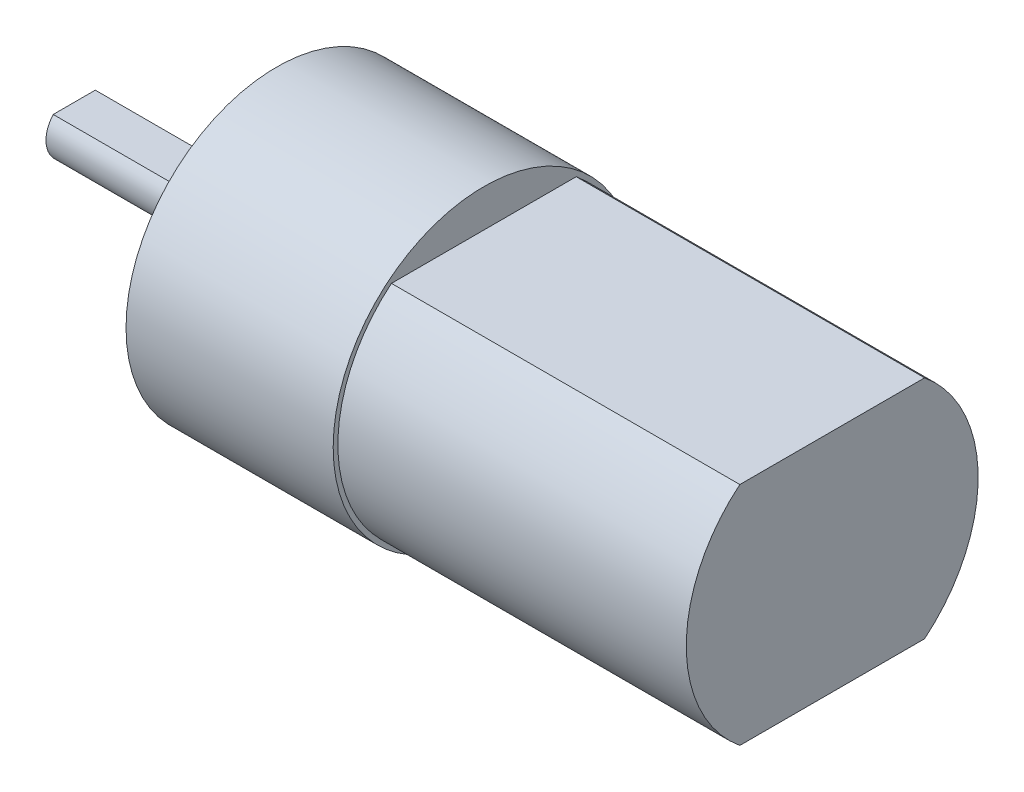
ISO-10303-21;
HEADER;
FILE_DESCRIPTION(('STEP AP214'),'2;1');
FILE_NAME('part.step','',(''),(''),'','','');
FILE_SCHEMA(('AUTOMOTIVE_DESIGN { 1 0 10303 214 1 1 1 1 }'));
ENDSEC;
DATA;
#1=APPLICATION_CONTEXT('core data for automotive mechanical design processes');
#2=APPLICATION_PROTOCOL_DEFINITION('international standard','automotive_design',2000,#1);
#3=PRODUCT_CONTEXT('',#1,'mechanical');
#4=PRODUCT('Part','Part','',(#3));
#5=PRODUCT_RELATED_PRODUCT_CATEGORY('part','',(#4));
#6=PRODUCT_DEFINITION_FORMATION('','',#4);
#7=PRODUCT_DEFINITION_CONTEXT('part definition',#1,'design');
#8=PRODUCT_DEFINITION('design','',#6,#7);
#9=PRODUCT_DEFINITION_SHAPE('','',#8);
#10=(LENGTH_UNIT() NAMED_UNIT(*) SI_UNIT(.MILLI.,.METRE.));
#11=(NAMED_UNIT(*) PLANE_ANGLE_UNIT() SI_UNIT($,.RADIAN.));
#12=(NAMED_UNIT(*) SI_UNIT($,.STERADIAN.) SOLID_ANGLE_UNIT());
#13=UNCERTAINTY_MEASURE_WITH_UNIT(LENGTH_MEASURE(1.E-05),#10,'distance_accuracy_value','');
#14=(GEOMETRIC_REPRESENTATION_CONTEXT(3) GLOBAL_UNCERTAINTY_ASSIGNED_CONTEXT((#13)) GLOBAL_UNIT_ASSIGNED_CONTEXT((#10,
#11,#12)) REPRESENTATION_CONTEXT('',''));
#15=CARTESIAN_POINT('',(0.,0.,0.));
#16=DIRECTION('',(0.,0.,1.));
#17=DIRECTION('',(1.,0.,0.));
#18=AXIS2_PLACEMENT_3D('',#15,#16,#17);
#19=CARTESIAN_POINT('',(-11.75,0.,0.));
#20=DIRECTION('',(-1.,0.,0.));
#21=DIRECTION('',(0.,0.,1.));
#22=AXIS2_PLACEMENT_3D('',#19,#20,#21);
#23=PLANE('',#22);
#24=CARTESIAN_POINT('',(-11.75,0.,0.));
#25=DIRECTION('',(-1.,0.,0.));
#26=DIRECTION('',(0.,0.,1.));
#27=AXIS2_PLACEMENT_3D('',#24,#25,#26);
#28=CIRCLE('',#27,2.);
#29=CARTESIAN_POINT('',(-11.75,0.,2.));
#30=VERTEX_POINT('',#29);
#31=EDGE_CURVE('E148',#30,#30,#28,.T.);
#32=ORIENTED_EDGE('',*,*,#31,.T.);
#33=EDGE_LOOP('',(#32));
#34=FACE_BOUND('',#33,.T.);
#35=CARTESIAN_POINT('',(-11.75,0.,0.));
#36=DIRECTION('',(-1.,0.,0.));
#37=DIRECTION('',(0.,0.,1.));
#38=AXIS2_PLACEMENT_3D('',#35,#36,#37);
#39=CIRCLE('',#38,1.5);
#40=CARTESIAN_POINT('',(-11.75,1.,-1.1180339887499));
#41=VERTEX_POINT('',#40);
#42=CARTESIAN_POINT('',(-11.75,1.,1.1180339887499));
#43=VERTEX_POINT('',#42);
#44=EDGE_CURVE('E141',#41,#43,#39,.T.);
#45=ORIENTED_EDGE('',*,*,#44,.F.);
#46=DIRECTION('',(0.,0.,-1.));
#47=VECTOR('',#46,1.);
#48=CARTESIAN_POINT('',(-11.75,1.,0.));
#49=LINE('',#48,#47);
#50=EDGE_CURVE('E142',#43,#41,#49,.T.);
#51=ORIENTED_EDGE('',*,*,#50,.F.);
#52=EDGE_LOOP('',(#45,#51));
#53=FACE_BOUND('',#52,.T.);
#54=ADVANCED_FACE('F35',(#34,#53),#23,.T.);
#55=CARTESIAN_POINT('',(-11.,0.,0.));
#56=DIRECTION('',(-1.,0.,0.));
#57=DIRECTION('',(0.,0.,1.));
#58=AXIS2_PLACEMENT_3D('',#55,#56,#57);
#59=PLANE('',#58);
#60=CARTESIAN_POINT('',(-11.,0.,4.5));
#61=DIRECTION('',(-1.,0.,0.));
#62=DIRECTION('',(0.,0.,1.));
#63=AXIS2_PLACEMENT_3D('',#60,#61,#62);
#64=CIRCLE('',#63,1.);
#65=CARTESIAN_POINT('',(-11.,0.,5.5));
#66=VERTEX_POINT('',#65);
#67=EDGE_CURVE('E340',#66,#66,#64,.T.);
#68=ORIENTED_EDGE('',*,*,#67,.F.);
#69=EDGE_LOOP('',(#68));
#70=FACE_BOUND('',#69,.T.);
#71=CARTESIAN_POINT('',(-11.,0.,-4.5));
#72=DIRECTION('',(-1.,0.,0.));
#73=DIRECTION('',(0.,0.,1.));
#74=AXIS2_PLACEMENT_3D('',#71,#72,#73);
#75=CIRCLE('',#74,1.);
#76=CARTESIAN_POINT('',(-11.,0.,-3.5));
#77=VERTEX_POINT('',#76);
#78=EDGE_CURVE('E339',#77,#77,#75,.T.);
#79=ORIENTED_EDGE('',*,*,#78,.F.);
#80=EDGE_LOOP('',(#79));
#81=FACE_BOUND('',#80,.T.);
#82=CARTESIAN_POINT('',(-11.,0.,0.));
#83=DIRECTION('',(-1.,0.,0.));
#84=DIRECTION('',(0.,0.,1.));
#85=AXIS2_PLACEMENT_3D('',#82,#83,#84);
#86=CIRCLE('',#85,8.);
#87=CARTESIAN_POINT('',(-11.,0.,8.));
#88=VERTEX_POINT('',#87);
#89=EDGE_CURVE('E109',#88,#88,#86,.T.);
#90=ORIENTED_EDGE('',*,*,#89,.T.);
#91=EDGE_LOOP('',(#90));
#92=FACE_BOUND('',#91,.T.);
#93=CARTESIAN_POINT('',(-11.,0.,0.));
#94=DIRECTION('',(-1.,0.,0.));
#95=DIRECTION('',(0.,0.,1.));
#96=AXIS2_PLACEMENT_3D('',#93,#94,#95);
#97=CIRCLE('',#96,2.);
#98=CARTESIAN_POINT('',(-11.,0.,2.));
#99=VERTEX_POINT('',#98);
#100=EDGE_CURVE('E145',#99,#99,#97,.T.);
#101=ORIENTED_EDGE('',*,*,#100,.F.);
#102=EDGE_LOOP('',(#101));
#103=FACE_BOUND('',#102,.T.);
#104=ADVANCED_FACE('F162',(#70,#81,#92,#103),#59,.T.);
#105=CARTESIAN_POINT('',(18.5,6.,0.));
#106=DIRECTION('',(0.,1.,0.));
#107=DIRECTION('',(0.,0.,1.));
#108=AXIS2_PLACEMENT_3D('',#105,#106,#107);
#109=PLANE('',#108);
#110=DIRECTION('',(0.,0.,-1.));
#111=VECTOR('',#110,1.);
#112=CARTESIAN_POINT('',(0.,6.,0.));
#113=LINE('',#112,#111);
#114=CARTESIAN_POINT('',(0.,6.,4.90535421758715));
#115=VERTEX_POINT('',#114);
#116=CARTESIAN_POINT('',(0.,6.,-4.90535421758715));
#117=VERTEX_POINT('',#116);
#118=EDGE_CURVE('E72',#115,#117,#113,.T.);
#119=ORIENTED_EDGE('',*,*,#118,.F.);
#120=DIRECTION('',(-1.,0.,0.));
#121=VECTOR('',#120,1.);
#122=CARTESIAN_POINT('',(18.5,6.,4.90535421758715));
#123=LINE('',#122,#121);
#124=CARTESIAN_POINT('',(18.5,6.,4.90535421758715));
#125=VERTEX_POINT('',#124);
#126=EDGE_CURVE('E11',#125,#115,#123,.T.);
#127=ORIENTED_EDGE('',*,*,#126,.F.);
#128=DIRECTION('',(0.,0.,-1.));
#129=VECTOR('',#128,1.);
#130=CARTESIAN_POINT('',(18.5,6.,0.));
#131=LINE('',#130,#129);
#132=CARTESIAN_POINT('',(18.5,6.,-4.90535421758715));
#133=VERTEX_POINT('',#132);
#134=EDGE_CURVE('E93',#125,#133,#131,.T.);
#135=ORIENTED_EDGE('',*,*,#134,.T.);
#136=DIRECTION('',(-1.,0.,0.));
#137=VECTOR('',#136,1.);
#138=CARTESIAN_POINT('',(18.5,6.,-4.90535421758715));
#139=LINE('',#138,#137);
#140=EDGE_CURVE('E104',#133,#117,#139,.T.);
#141=ORIENTED_EDGE('',*,*,#140,.T.);
#142=EDGE_LOOP('',(#119,#127,#135,#141));
#143=FACE_BOUND('',#142,.T.);
#144=ADVANCED_FACE('F37',(#143),#109,.T.);
#145=CARTESIAN_POINT('',(18.5,0.,0.));
#146=DIRECTION('',(-1.,0.,0.));
#147=DIRECTION('',(0.,0.,1.));
#148=AXIS2_PLACEMENT_3D('',#145,#146,#147);
#149=CYLINDRICAL_SURFACE('',#148,7.75);
#150=CARTESIAN_POINT('',(0.,0.,0.));
#151=DIRECTION('',(1.,0.,0.));
#152=DIRECTION('',(0.,0.,-1.));
#153=AXIS2_PLACEMENT_3D('',#150,#151,#152);
#154=CIRCLE('',#153,7.75);
#155=CARTESIAN_POINT('',(0.,-6.,4.90535421758714));
#156=VERTEX_POINT('',#155);
#157=EDGE_CURVE('E80',#115,#156,#154,.T.);
#158=ORIENTED_EDGE('',*,*,#157,.T.);
#159=DIRECTION('',(-1.,0.,0.));
#160=VECTOR('',#159,1.);
#161=CARTESIAN_POINT('',(18.5,-6.,4.90535421758714));
#162=LINE('',#161,#160);
#163=CARTESIAN_POINT('',(18.5,-6.,4.90535421758714));
#164=VERTEX_POINT('',#163);
#165=EDGE_CURVE('E43',#164,#156,#162,.T.);
#166=ORIENTED_EDGE('',*,*,#165,.F.);
#167=CARTESIAN_POINT('',(18.5,0.,0.));
#168=DIRECTION('',(1.,0.,0.));
#169=DIRECTION('',(0.,0.,-1.));
#170=AXIS2_PLACEMENT_3D('',#167,#168,#169);
#171=CIRCLE('',#170,7.75);
#172=EDGE_CURVE('E86',#125,#164,#171,.T.);
#173=ORIENTED_EDGE('',*,*,#172,.F.);
#174=ORIENTED_EDGE('',*,*,#126,.T.);
#175=EDGE_LOOP('',(#158,#166,#173,#174));
#176=FACE_BOUND('',#175,.T.);
#177=ADVANCED_FACE('F97',(#176),#149,.T.);
#178=CARTESIAN_POINT('',(18.5,-6.,0.));
#179=DIRECTION('',(0.,1.,0.));
#180=DIRECTION('',(0.,0.,1.));
#181=AXIS2_PLACEMENT_3D('',#178,#179,#180);
#182=PLANE('',#181);
#183=DIRECTION('',(0.,0.,-1.));
#184=VECTOR('',#183,1.);
#185=CARTESIAN_POINT('',(0.,-6.,0.));
#186=LINE('',#185,#184);
#187=CARTESIAN_POINT('',(0.,-6.,-4.90535421758715));
#188=VERTEX_POINT('',#187);
#189=EDGE_CURVE('E111',#156,#188,#186,.T.);
#190=ORIENTED_EDGE('',*,*,#189,.T.);
#191=DIRECTION('',(-1.,0.,0.));
#192=VECTOR('',#191,1.);
#193=CARTESIAN_POINT('',(18.5,-6.,-4.90535421758715));
#194=LINE('',#193,#192);
#195=CARTESIAN_POINT('',(18.5,-6.,-4.90535421758715));
#196=VERTEX_POINT('',#195);
#197=EDGE_CURVE('E100',#196,#188,#194,.T.);
#198=ORIENTED_EDGE('',*,*,#197,.F.);
#199=DIRECTION('',(0.,0.,-1.));
#200=VECTOR('',#199,1.);
#201=CARTESIAN_POINT('',(18.5,-6.,0.));
#202=LINE('',#201,#200);
#203=EDGE_CURVE('E90',#164,#196,#202,.T.);
#204=ORIENTED_EDGE('',*,*,#203,.F.);
#205=ORIENTED_EDGE('',*,*,#165,.T.);
#206=EDGE_LOOP('',(#190,#198,#204,#205));
#207=FACE_BOUND('',#206,.T.);
#208=ADVANCED_FACE('F101',(#207),#182,.F.);
#209=CARTESIAN_POINT('',(18.5,0.,0.));
#210=DIRECTION('',(-1.,0.,0.));
#211=DIRECTION('',(0.,0.,1.));
#212=AXIS2_PLACEMENT_3D('',#209,#210,#211);
#213=CYLINDRICAL_SURFACE('',#212,7.75);
#214=CARTESIAN_POINT('',(0.,0.,0.));
#215=DIRECTION('',(1.,0.,0.));
#216=DIRECTION('',(0.,0.,-1.));
#217=AXIS2_PLACEMENT_3D('',#214,#215,#216);
#218=CIRCLE('',#217,7.75);
#219=EDGE_CURVE('E113',#188,#117,#218,.T.);
#220=ORIENTED_EDGE('',*,*,#219,.T.);
#221=ORIENTED_EDGE('',*,*,#140,.F.);
#222=CARTESIAN_POINT('',(18.5,0.,0.));
#223=DIRECTION('',(1.,0.,0.));
#224=DIRECTION('',(0.,0.,-1.));
#225=AXIS2_PLACEMENT_3D('',#222,#223,#224);
#226=CIRCLE('',#225,7.75);
#227=EDGE_CURVE('E59',#196,#133,#226,.T.);
#228=ORIENTED_EDGE('',*,*,#227,.F.);
#229=ORIENTED_EDGE('',*,*,#197,.T.);
#230=EDGE_LOOP('',(#220,#221,#228,#229));
#231=FACE_BOUND('',#230,.T.);
#232=ADVANCED_FACE('F118',(#231),#213,.T.);
#233=CARTESIAN_POINT('',(18.5,0.,0.));
#234=DIRECTION('',(1.,0.,0.));
#235=DIRECTION('',(0.,0.,-1.));
#236=AXIS2_PLACEMENT_3D('',#233,#234,#235);
#237=PLANE('',#236);
#238=ORIENTED_EDGE('',*,*,#134,.F.);
#239=ORIENTED_EDGE('',*,*,#172,.T.);
#240=ORIENTED_EDGE('',*,*,#203,.T.);
#241=ORIENTED_EDGE('',*,*,#227,.T.);
#242=EDGE_LOOP('',(#238,#239,#240,#241));
#243=FACE_BOUND('',#242,.T.);
#244=ADVANCED_FACE('F88',(#243),#237,.T.);
#245=CARTESIAN_POINT('',(-11.,0.,0.));
#246=DIRECTION('',(1.,0.,0.));
#247=DIRECTION('',(0.,0.,-1.));
#248=AXIS2_PLACEMENT_3D('',#245,#246,#247);
#249=CYLINDRICAL_SURFACE('',#248,8.);
#250=ORIENTED_EDGE('',*,*,#89,.F.);
#251=EDGE_LOOP('',(#250));
#252=FACE_BOUND('',#251,.T.);
#253=CARTESIAN_POINT('',(0.,0.,0.));
#254=DIRECTION('',(-1.,0.,0.));
#255=DIRECTION('',(0.,0.,1.));
#256=AXIS2_PLACEMENT_3D('',#253,#254,#255);
#257=CIRCLE('',#256,8.);
#258=CARTESIAN_POINT('',(0.,0.,8.));
#259=VERTEX_POINT('',#258);
#260=EDGE_CURVE('E155',#259,#259,#257,.T.);
#261=ORIENTED_EDGE('',*,*,#260,.T.);
#262=EDGE_LOOP('',(#261));
#263=FACE_BOUND('',#262,.T.);
#264=ADVANCED_FACE('F185',(#252,#263),#249,.T.);
#265=CARTESIAN_POINT('',(0.,0.,0.));
#266=DIRECTION('',(-1.,0.,0.));
#267=DIRECTION('',(0.,0.,1.));
#268=AXIS2_PLACEMENT_3D('',#265,#266,#267);
#269=PLANE('',#268);
#270=ORIENTED_EDGE('',*,*,#118,.T.);
#271=ORIENTED_EDGE('',*,*,#219,.F.);
#272=ORIENTED_EDGE('',*,*,#189,.F.);
#273=ORIENTED_EDGE('',*,*,#157,.F.);
#274=EDGE_LOOP('',(#270,#271,#272,#273));
#275=FACE_BOUND('',#274,.T.);
#276=ORIENTED_EDGE('',*,*,#260,.F.);
#277=EDGE_LOOP('',(#276));
#278=FACE_BOUND('',#277,.T.);
#279=ADVANCED_FACE('F180',(#275,#278),#269,.F.);
#280=CARTESIAN_POINT('',(-11.75,0.,0.));
#281=DIRECTION('',(1.,0.,0.));
#282=DIRECTION('',(0.,0.,-1.));
#283=AXIS2_PLACEMENT_3D('',#280,#281,#282);
#284=CYLINDRICAL_SURFACE('',#283,2.);
#285=ORIENTED_EDGE('',*,*,#31,.F.);
#286=EDGE_LOOP('',(#285));
#287=FACE_BOUND('',#286,.T.);
#288=ORIENTED_EDGE('',*,*,#100,.T.);
#289=EDGE_LOOP('',(#288));
#290=FACE_BOUND('',#289,.T.);
#291=ADVANCED_FACE('F178',(#287,#290),#284,.T.);
#292=CARTESIAN_POINT('',(-21.75,0.,0.));
#293=DIRECTION('',(1.,0.,0.));
#294=DIRECTION('',(0.,0.,-1.));
#295=AXIS2_PLACEMENT_3D('',#292,#293,#294);
#296=CYLINDRICAL_SURFACE('',#295,1.5);
#297=CARTESIAN_POINT('',(-21.75,0.,0.));
#298=DIRECTION('',(-1.,0.,0.));
#299=DIRECTION('',(0.,0.,1.));
#300=AXIS2_PLACEMENT_3D('',#297,#298,#299);
#301=CIRCLE('',#300,1.5);
#302=CARTESIAN_POINT('',(-21.75,1.,-1.1180339887499));
#303=VERTEX_POINT('',#302);
#304=CARTESIAN_POINT('',(-21.75,1.,1.1180339887499));
#305=VERTEX_POINT('',#304);
#306=EDGE_CURVE('E139',#303,#305,#301,.T.);
#307=ORIENTED_EDGE('',*,*,#306,.F.);
#308=DIRECTION('',(-1.,0.,0.));
#309=VECTOR('',#308,1.);
#310=CARTESIAN_POINT('',(-9.45871215252208,1.,-1.1180339887499));
#311=LINE('',#310,#309);
#312=EDGE_CURVE('E50',#41,#303,#311,.T.);
#313=ORIENTED_EDGE('',*,*,#312,.F.);
#314=ORIENTED_EDGE('',*,*,#44,.T.);
#315=DIRECTION('',(-1.,0.,0.));
#316=VECTOR('',#315,1.);
#317=CARTESIAN_POINT('',(-9.45871215252208,1.,1.1180339887499));
#318=LINE('',#317,#316);
#319=EDGE_CURVE('E129',#43,#305,#318,.T.);
#320=ORIENTED_EDGE('',*,*,#319,.T.);
#321=EDGE_LOOP('',(#307,#313,#314,#320));
#322=FACE_BOUND('',#321,.T.);
#323=ADVANCED_FACE('F138',(#322),#296,.T.);
#324=CARTESIAN_POINT('',(-21.75,0.,0.));
#325=DIRECTION('',(-1.,0.,0.));
#326=DIRECTION('',(0.,0.,1.));
#327=AXIS2_PLACEMENT_3D('',#324,#325,#326);
#328=PLANE('',#327);
#329=DIRECTION('',(0.,0.,1.));
#330=VECTOR('',#329,1.);
#331=CARTESIAN_POINT('',(-21.75,1.,0.));
#332=LINE('',#331,#330);
#333=EDGE_CURVE('E126',#303,#305,#332,.T.);
#334=ORIENTED_EDGE('',*,*,#333,.F.);
#335=ORIENTED_EDGE('',*,*,#306,.T.);
#336=EDGE_LOOP('',(#334,#335));
#337=FACE_BOUND('',#336,.T.);
#338=ADVANCED_FACE('F144',(#337),#328,.T.);
#339=CARTESIAN_POINT('',(-9.45871215252208,1.,0.));
#340=DIRECTION('',(0.,-1.,0.));
#341=DIRECTION('',(0.,0.,-1.));
#342=AXIS2_PLACEMENT_3D('',#339,#340,#341);
#343=PLANE('',#342);
#344=ORIENTED_EDGE('',*,*,#50,.T.);
#345=ORIENTED_EDGE('',*,*,#312,.T.);
#346=ORIENTED_EDGE('',*,*,#333,.T.);
#347=ORIENTED_EDGE('',*,*,#319,.F.);
#348=EDGE_LOOP('',(#344,#345,#346,#347));
#349=FACE_BOUND('',#348,.T.);
#350=ADVANCED_FACE('F128',(#349),#343,.F.);
#351=CARTESIAN_POINT('',(-8.,0.,-4.5));
#352=DIRECTION('',(-1.,0.,0.));
#353=DIRECTION('',(0.,0.,1.));
#354=AXIS2_PLACEMENT_3D('',#351,#352,#353);
#355=CYLINDRICAL_SURFACE('',#354,1.);
#356=CARTESIAN_POINT('',(-8.,0.,-4.5));
#357=DIRECTION('',(-1.,0.,0.));
#358=DIRECTION('',(0.,0.,1.));
#359=AXIS2_PLACEMENT_3D('',#356,#357,#358);
#360=CIRCLE('',#359,1.);
#361=CARTESIAN_POINT('',(-8.,0.,-3.5));
#362=VERTEX_POINT('',#361);
#363=EDGE_CURVE('E134',#362,#362,#360,.T.);
#364=ORIENTED_EDGE('',*,*,#363,.F.);
#365=EDGE_LOOP('',(#364));
#366=FACE_BOUND('',#365,.T.);
#367=ORIENTED_EDGE('',*,*,#78,.T.);
#368=EDGE_LOOP('',(#367));
#369=FACE_BOUND('',#368,.T.);
#370=ADVANCED_FACE('F234',(#366,#369),#355,.F.);
#371=CARTESIAN_POINT('',(-8.,0.,0.));
#372=DIRECTION('',(-1.,0.,0.));
#373=DIRECTION('',(0.,0.,1.));
#374=AXIS2_PLACEMENT_3D('',#371,#372,#373);
#375=PLANE('',#374);
#376=ORIENTED_EDGE('',*,*,#363,.T.);
#377=EDGE_LOOP('',(#376));
#378=FACE_BOUND('',#377,.T.);
#379=ADVANCED_FACE('F242',(#378),#375,.T.);
#380=CARTESIAN_POINT('',(-8.,0.,4.5));
#381=DIRECTION('',(-1.,0.,0.));
#382=DIRECTION('',(0.,0.,1.));
#383=AXIS2_PLACEMENT_3D('',#380,#381,#382);
#384=CYLINDRICAL_SURFACE('',#383,1.);
#385=CARTESIAN_POINT('',(-8.,0.,4.5));
#386=DIRECTION('',(-1.,0.,0.));
#387=DIRECTION('',(0.,0.,1.));
#388=AXIS2_PLACEMENT_3D('',#385,#386,#387);
#389=CIRCLE('',#388,1.);
#390=CARTESIAN_POINT('',(-8.,0.,5.5));
#391=VERTEX_POINT('',#390);
#392=EDGE_CURVE('E338',#391,#391,#389,.T.);
#393=ORIENTED_EDGE('',*,*,#392,.F.);
#394=EDGE_LOOP('',(#393));
#395=FACE_BOUND('',#394,.T.);
#396=ORIENTED_EDGE('',*,*,#67,.T.);
#397=EDGE_LOOP('',(#396));
#398=FACE_BOUND('',#397,.T.);
#399=ADVANCED_FACE('F250',(#395,#398),#384,.F.);
#400=CARTESIAN_POINT('',(-8.,0.,0.));
#401=DIRECTION('',(-1.,0.,0.));
#402=DIRECTION('',(0.,0.,1.));
#403=AXIS2_PLACEMENT_3D('',#400,#401,#402);
#404=PLANE('',#403);
#405=ORIENTED_EDGE('',*,*,#392,.T.);
#406=EDGE_LOOP('',(#405));
#407=FACE_BOUND('',#406,.T.);
#408=ADVANCED_FACE('F258',(#407),#404,.T.);
#409=CLOSED_SHELL('',(#54,#104,#144,#177,#208,#232,#244,#264,#279,#291,#323,#338,#350,#370,#379,
#399,#408));
#410=MANIFOLD_SOLID_BREP('B2',#409);
#411=ADVANCED_BREP_SHAPE_REPRESENTATION('',(#18,#410),#14);
#412=SHAPE_DEFINITION_REPRESENTATION(#9,#411);
ENDSEC;
END-ISO-10303-21;
